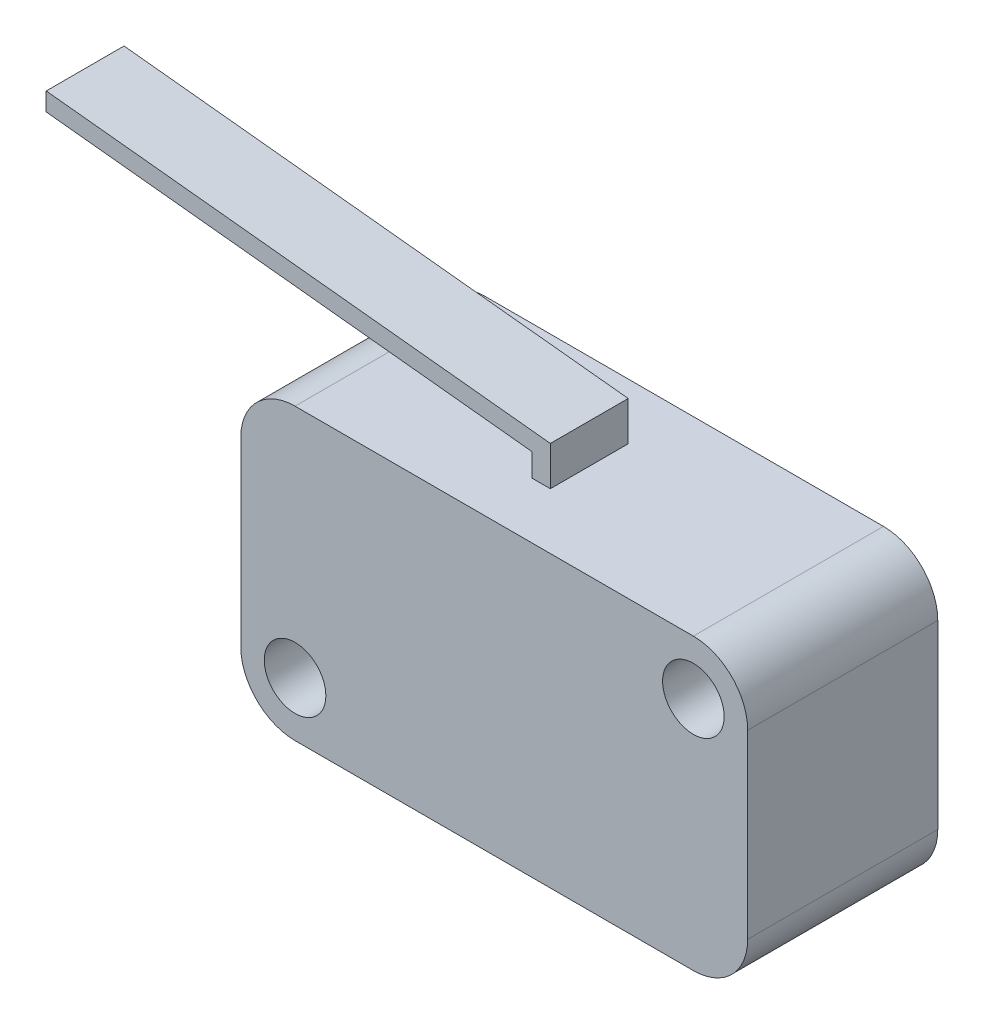
ISO-10303-21;
HEADER;
FILE_DESCRIPTION(('STEP AP214'),'2;1');
FILE_NAME('part.step','',(''),(''),'','','');
FILE_SCHEMA(('AUTOMOTIVE_DESIGN { 1 0 10303 214 1 1 1 1 }'));
ENDSEC;
DATA;
#1=APPLICATION_CONTEXT('core data for automotive mechanical design processes');
#2=APPLICATION_PROTOCOL_DEFINITION('international standard','automotive_design',2000,#1);
#3=PRODUCT_CONTEXT('',#1,'mechanical');
#4=PRODUCT('Part','Part','',(#3));
#5=PRODUCT_RELATED_PRODUCT_CATEGORY('part','',(#4));
#6=PRODUCT_DEFINITION_FORMATION('','',#4);
#7=PRODUCT_DEFINITION_CONTEXT('part definition',#1,'design');
#8=PRODUCT_DEFINITION('design','',#6,#7);
#9=PRODUCT_DEFINITION_SHAPE('','',#8);
#10=(LENGTH_UNIT() NAMED_UNIT(*) SI_UNIT(.MILLI.,.METRE.));
#11=(NAMED_UNIT(*) PLANE_ANGLE_UNIT() SI_UNIT($,.RADIAN.));
#12=(NAMED_UNIT(*) SI_UNIT($,.STERADIAN.) SOLID_ANGLE_UNIT());
#13=UNCERTAINTY_MEASURE_WITH_UNIT(LENGTH_MEASURE(1.E-05),#10,'distance_accuracy_value','');
#14=(GEOMETRIC_REPRESENTATION_CONTEXT(3) GLOBAL_UNCERTAINTY_ASSIGNED_CONTEXT((#13)) GLOBAL_UNIT_ASSIGNED_CONTEXT((#10,
#11,#12)) REPRESENTATION_CONTEXT('',''));
#15=CARTESIAN_POINT('',(0.,0.,0.));
#16=DIRECTION('',(0.,0.,1.));
#17=DIRECTION('',(1.,0.,0.));
#18=AXIS2_PLACEMENT_3D('',#15,#16,#17);
#19=CARTESIAN_POINT('',(0.,8.,38.8095787479277));
#20=DIRECTION('',(-1.,0.,0.));
#21=DIRECTION('',(0.,-1.,0.));
#22=AXIS2_PLACEMENT_3D('',#19,#20,#21);
#23=PLANE('',#22);
#24=DIRECTION('',(0.,0.,-1.));
#25=VECTOR('',#24,1.);
#26=CARTESIAN_POINT('',(0.,8.,38.8095787479277));
#27=LINE('',#26,#25);
#28=CARTESIAN_POINT('',(0.,8.,7.4));
#29=VERTEX_POINT('',#28);
#30=CARTESIAN_POINT('',(0.,8.,3.1));
#31=VERTEX_POINT('',#30);
#32=EDGE_CURVE('E153',#29,#31,#27,.T.);
#33=ORIENTED_EDGE('',*,*,#32,.T.);
#34=DIRECTION('',(0.,-1.,0.));
#35=VECTOR('',#34,1.);
#36=CARTESIAN_POINT('',(0.,8.,3.1));
#37=LINE('',#36,#35);
#38=CARTESIAN_POINT('',(0.,10.1671145368648,3.1));
#39=VERTEX_POINT('',#38);
#40=EDGE_CURVE('E136',#39,#31,#37,.T.);
#41=ORIENTED_EDGE('',*,*,#40,.F.);
#42=DIRECTION('',(0.,0.,-1.));
#43=VECTOR('',#42,1.);
#44=CARTESIAN_POINT('',(0.,10.1671145368648,38.8095787479277));
#45=LINE('',#44,#43);
#46=CARTESIAN_POINT('',(0.,10.1671145368648,7.4));
#47=VERTEX_POINT('',#46);
#48=EDGE_CURVE('E160',#47,#39,#45,.T.);
#49=ORIENTED_EDGE('',*,*,#48,.F.);
#50=DIRECTION('',(0.,1.,0.));
#51=VECTOR('',#50,1.);
#52=CARTESIAN_POINT('',(0.,13.1055525503102,7.4));
#53=LINE('',#52,#51);
#54=EDGE_CURVE('E159',#29,#47,#53,.T.);
#55=ORIENTED_EDGE('',*,*,#54,.F.);
#56=EDGE_LOOP('',(#33,#41,#49,#55));
#57=FACE_BOUND('',#56,.T.);
#58=ADVANCED_FACE('F35',(#57),#23,.F.);
#59=CARTESIAN_POINT('',(0.,10.1671145368648,38.8095787479277));
#60=DIRECTION('',(-0.104944214765905,-0.994478110260436,0.));
#61=DIRECTION('',(0.994478110260436,-0.104944214765905,0.));
#62=AXIS2_PLACEMENT_3D('',#59,#60,#61);
#63=PLANE('',#62);
#64=ORIENTED_EDGE('',*,*,#48,.T.);
#65=DIRECTION('',(-0.994478110260436,0.104944214765905,0.));
#66=VECTOR('',#65,1.);
#67=CARTESIAN_POINT('',(0.,10.1671145368648,3.1));
#68=LINE('',#67,#66);
#69=CARTESIAN_POINT('',(-27.8453870872922,13.1055525503102,3.1));
#70=VERTEX_POINT('',#69);
#71=EDGE_CURVE('E142',#39,#70,#68,.T.);
#72=ORIENTED_EDGE('',*,*,#71,.T.);
#73=DIRECTION('',(0.,0.,-1.));
#74=VECTOR('',#73,1.);
#75=CARTESIAN_POINT('',(-27.8453870872922,13.1055525503102,38.8095787479277));
#76=LINE('',#75,#74);
#77=CARTESIAN_POINT('',(-27.8453870872922,13.1055525503102,7.4));
#78=VERTEX_POINT('',#77);
#79=EDGE_CURVE('E162',#78,#70,#76,.T.);
#80=ORIENTED_EDGE('',*,*,#79,.F.);
#81=DIRECTION('',(-0.994478110260436,0.104944214765905,0.));
#82=VECTOR('',#81,1.);
#83=CARTESIAN_POINT('',(0.,10.1671145368648,7.4));
#84=LINE('',#83,#82);
#85=EDGE_CURVE('E164',#47,#78,#84,.T.);
#86=ORIENTED_EDGE('',*,*,#85,.F.);
#87=EDGE_LOOP('',(#64,#72,#80,#86));
#88=FACE_BOUND('',#87,.T.);
#89=ADVANCED_FACE('F287',(#88),#63,.F.);
#90=CARTESIAN_POINT('',(-27.8453870872922,13.1055525503102,38.8095787479277));
#91=DIRECTION('',(1.,0.,0.));
#92=DIRECTION('',(0.,1.,0.));
#93=AXIS2_PLACEMENT_3D('',#90,#91,#92);
#94=PLANE('',#93);
#95=ORIENTED_EDGE('',*,*,#79,.T.);
#96=DIRECTION('',(0.,-1.,0.));
#97=VECTOR('',#96,1.);
#98=CARTESIAN_POINT('',(-27.8453870872922,13.1055525503102,3.1));
#99=LINE('',#98,#97);
#100=CARTESIAN_POINT('',(-27.8453870872922,12.1,3.1));
#101=VERTEX_POINT('',#100);
#102=EDGE_CURVE('E460',#70,#101,#99,.T.);
#103=ORIENTED_EDGE('',*,*,#102,.T.);
#104=DIRECTION('',(0.,0.,-1.));
#105=VECTOR('',#104,1.);
#106=CARTESIAN_POINT('',(-27.8453870872922,12.1,38.8095787479277));
#107=LINE('',#106,#105);
#108=CARTESIAN_POINT('',(-27.8453870872922,12.1,7.4));
#109=VERTEX_POINT('',#108);
#110=EDGE_CURVE('E171',#109,#101,#107,.T.);
#111=ORIENTED_EDGE('',*,*,#110,.F.);
#112=DIRECTION('',(0.,-1.,0.));
#113=VECTOR('',#112,1.);
#114=CARTESIAN_POINT('',(-27.8453870872922,13.1055525503102,7.4));
#115=LINE('',#114,#113);
#116=EDGE_CURVE('E466',#78,#109,#115,.T.);
#117=ORIENTED_EDGE('',*,*,#116,.F.);
#118=EDGE_LOOP('',(#95,#103,#111,#117));
#119=FACE_BOUND('',#118,.T.);
#120=ADVANCED_FACE('F292',(#119),#94,.F.);
#121=CARTESIAN_POINT('',(-27.8453870872922,12.1,38.8095787479277));
#122=DIRECTION('',(0.104944214765905,0.994478110260436,0.));
#123=DIRECTION('',(-0.994478110260436,0.104944214765905,0.));
#124=AXIS2_PLACEMENT_3D('',#121,#122,#123);
#125=PLANE('',#124);
#126=ORIENTED_EDGE('',*,*,#110,.T.);
#127=DIRECTION('',(0.994478110260436,-0.104944214765905,0.));
#128=VECTOR('',#127,1.);
#129=CARTESIAN_POINT('',(-27.8453870872922,12.1,3.1));
#130=LINE('',#129,#128);
#131=CARTESIAN_POINT('',(-1.,9.26708890935282,3.1));
#132=VERTEX_POINT('',#131);
#133=EDGE_CURVE('E458',#101,#132,#130,.T.);
#134=ORIENTED_EDGE('',*,*,#133,.T.);
#135=DIRECTION('',(0.,0.,-1.));
#136=VECTOR('',#135,1.);
#137=CARTESIAN_POINT('',(-1.,9.26708890935282,38.8095787479277));
#138=LINE('',#137,#136);
#139=CARTESIAN_POINT('',(-1.,9.26708890935282,7.4));
#140=VERTEX_POINT('',#139);
#141=EDGE_CURVE('E174',#140,#132,#138,.T.);
#142=ORIENTED_EDGE('',*,*,#141,.F.);
#143=DIRECTION('',(0.994478110260436,-0.104944214765905,0.));
#144=VECTOR('',#143,1.);
#145=CARTESIAN_POINT('',(-27.8453870872922,12.1,7.4));
#146=LINE('',#145,#144);
#147=EDGE_CURVE('E49',#109,#140,#146,.T.);
#148=ORIENTED_EDGE('',*,*,#147,.F.);
#149=EDGE_LOOP('',(#126,#134,#142,#148));
#150=FACE_BOUND('',#149,.T.);
#151=ADVANCED_FACE('F372',(#150),#125,.F.);
#152=CARTESIAN_POINT('',(-1.,9.26708890935282,38.8095787479277));
#153=DIRECTION('',(1.,0.,0.));
#154=DIRECTION('',(0.,1.,0.));
#155=AXIS2_PLACEMENT_3D('',#152,#153,#154);
#156=PLANE('',#155);
#157=ORIENTED_EDGE('',*,*,#141,.T.);
#158=DIRECTION('',(0.,-1.,0.));
#159=VECTOR('',#158,1.);
#160=CARTESIAN_POINT('',(-1.,9.26708890935282,3.1));
#161=LINE('',#160,#159);
#162=CARTESIAN_POINT('',(-0.999999999999999,8.,3.1));
#163=VERTEX_POINT('',#162);
#164=EDGE_CURVE('E156',#132,#163,#161,.T.);
#165=ORIENTED_EDGE('',*,*,#164,.T.);
#166=DIRECTION('',(0.,0.,-1.));
#167=VECTOR('',#166,1.);
#168=CARTESIAN_POINT('',(-1.,8.,38.8095787479277));
#169=LINE('',#168,#167);
#170=CARTESIAN_POINT('',(-1.,8.,7.4));
#171=VERTEX_POINT('',#170);
#172=EDGE_CURVE('E155',#171,#163,#169,.T.);
#173=ORIENTED_EDGE('',*,*,#172,.F.);
#174=DIRECTION('',(0.,-1.,0.));
#175=VECTOR('',#174,1.);
#176=CARTESIAN_POINT('',(-1.,9.26708890935282,7.4));
#177=LINE('',#176,#175);
#178=EDGE_CURVE('E11',#140,#171,#177,.T.);
#179=ORIENTED_EDGE('',*,*,#178,.F.);
#180=EDGE_LOOP('',(#157,#165,#173,#179));
#181=FACE_BOUND('',#180,.T.);
#182=ADVANCED_FACE('F312',(#181),#156,.F.);
#183=CARTESIAN_POINT('',(14.,8.,10.5));
#184=DIRECTION('',(0.,-1.,0.));
#185=DIRECTION('',(0.,0.,-1.));
#186=AXIS2_PLACEMENT_3D('',#183,#184,#185);
#187=PLANE('',#186);
#188=DIRECTION('',(-1.,0.,0.));
#189=VECTOR('',#188,1.);
#190=CARTESIAN_POINT('',(14.,8.,0.));
#191=LINE('',#190,#189);
#192=CARTESIAN_POINT('',(11.,8.,0.));
#193=VERTEX_POINT('',#192);
#194=CARTESIAN_POINT('',(-11.,8.,0.));
#195=VERTEX_POINT('',#194);
#196=EDGE_CURVE('E194',#193,#195,#191,.T.);
#197=ORIENTED_EDGE('',*,*,#196,.T.);
#198=DIRECTION('',(0.,0.,-1.));
#199=VECTOR('',#198,1.);
#200=CARTESIAN_POINT('',(-11.,8.,10.5));
#201=LINE('',#200,#199);
#202=CARTESIAN_POINT('',(-11.,8.,10.5));
#203=VERTEX_POINT('',#202);
#204=EDGE_CURVE('E227',#195,#203,#201,.F.);
#205=ORIENTED_EDGE('',*,*,#204,.T.);
#206=DIRECTION('',(-1.,0.,0.));
#207=VECTOR('',#206,1.);
#208=CARTESIAN_POINT('',(14.,8.,10.5));
#209=LINE('',#208,#207);
#210=CARTESIAN_POINT('',(11.,8.,10.5));
#211=VERTEX_POINT('',#210);
#212=EDGE_CURVE('E199',#211,#203,#209,.T.);
#213=ORIENTED_EDGE('',*,*,#212,.F.);
#214=DIRECTION('',(0.,0.,-1.));
#215=VECTOR('',#214,1.);
#216=CARTESIAN_POINT('',(11.,8.,10.5));
#217=LINE('',#216,#215);
#218=EDGE_CURVE('E224',#211,#193,#217,.T.);
#219=ORIENTED_EDGE('',*,*,#218,.T.);
#220=EDGE_LOOP('',(#197,#205,#213,#219));
#221=FACE_BOUND('',#220,.T.);
#222=ORIENTED_EDGE('',*,*,#172,.T.);
#223=DIRECTION('',(-1.,0.,0.));
#224=VECTOR('',#223,1.);
#225=CARTESIAN_POINT('',(0.,8.,3.1));
#226=LINE('',#225,#224);
#227=EDGE_CURVE('E139',#31,#163,#226,.T.);
#228=ORIENTED_EDGE('',*,*,#227,.F.);
#229=ORIENTED_EDGE('',*,*,#32,.F.);
#230=DIRECTION('',(1.,0.,0.));
#231=VECTOR('',#230,1.);
#232=CARTESIAN_POINT('',(-27.8453870872922,8.,7.4));
#233=LINE('',#232,#231);
#234=EDGE_CURVE('E468',#171,#29,#233,.T.);
#235=ORIENTED_EDGE('',*,*,#234,.F.);
#236=EDGE_LOOP('',(#222,#228,#229,#235));
#237=FACE_BOUND('',#236,.T.);
#238=ADVANCED_FACE('F151',(#221,#237),#187,.F.);
#239=CARTESIAN_POINT('',(-14.,-8.,10.5));
#240=DIRECTION('',(1.,0.,0.));
#241=DIRECTION('',(0.,1.,0.));
#242=AXIS2_PLACEMENT_3D('',#239,#240,#241);
#243=PLANE('',#242);
#244=DIRECTION('',(0.,-1.,0.));
#245=VECTOR('',#244,1.);
#246=CARTESIAN_POINT('',(-14.,-8.,10.5));
#247=LINE('',#246,#245);
#248=CARTESIAN_POINT('',(-14.,5.,10.5));
#249=VERTEX_POINT('',#248);
#250=CARTESIAN_POINT('',(-14.,-5.,10.5));
#251=VERTEX_POINT('',#250);
#252=EDGE_CURVE('E190',#249,#251,#247,.T.);
#253=ORIENTED_EDGE('',*,*,#252,.F.);
#254=DIRECTION('',(0.,0.,-1.));
#255=VECTOR('',#254,1.);
#256=CARTESIAN_POINT('',(-14.,5.,10.5));
#257=LINE('',#256,#255);
#258=CARTESIAN_POINT('',(-14.,5.,0.));
#259=VERTEX_POINT('',#258);
#260=EDGE_CURVE('E212',#249,#259,#257,.T.);
#261=ORIENTED_EDGE('',*,*,#260,.T.);
#262=DIRECTION('',(0.,-1.,0.));
#263=VECTOR('',#262,1.);
#264=CARTESIAN_POINT('',(-14.,-8.,0.));
#265=LINE('',#264,#263);
#266=CARTESIAN_POINT('',(-14.,-5.,0.));
#267=VERTEX_POINT('',#266);
#268=EDGE_CURVE('E181',#259,#267,#265,.T.);
#269=ORIENTED_EDGE('',*,*,#268,.T.);
#270=DIRECTION('',(0.,0.,-1.));
#271=VECTOR('',#270,1.);
#272=CARTESIAN_POINT('',(-14.,-5.,10.5));
#273=LINE('',#272,#271);
#274=EDGE_CURVE('E202',#267,#251,#273,.F.);
#275=ORIENTED_EDGE('',*,*,#274,.T.);
#276=EDGE_LOOP('',(#253,#261,#269,#275));
#277=FACE_BOUND('',#276,.T.);
#278=ADVANCED_FACE('F276',(#277),#243,.F.);
#279=CARTESIAN_POINT('',(14.,-8.,10.5));
#280=DIRECTION('',(0.,1.,0.));
#281=DIRECTION('',(-1.,0.,0.));
#282=AXIS2_PLACEMENT_3D('',#279,#280,#281);
#283=PLANE('',#282);
#284=DIRECTION('',(1.,0.,0.));
#285=VECTOR('',#284,1.);
#286=CARTESIAN_POINT('',(14.,-8.,0.));
#287=LINE('',#286,#285);
#288=CARTESIAN_POINT('',(-11.,-8.,0.));
#289=VERTEX_POINT('',#288);
#290=CARTESIAN_POINT('',(11.,-8.,0.));
#291=VERTEX_POINT('',#290);
#292=EDGE_CURVE('E205',#289,#291,#287,.T.);
#293=ORIENTED_EDGE('',*,*,#292,.T.);
#294=DIRECTION('',(0.,0.,-1.));
#295=VECTOR('',#294,1.);
#296=CARTESIAN_POINT('',(11.,-8.,10.5));
#297=LINE('',#296,#295);
#298=CARTESIAN_POINT('',(11.,-8.,10.5));
#299=VERTEX_POINT('',#298);
#300=EDGE_CURVE('E43',#291,#299,#297,.F.);
#301=ORIENTED_EDGE('',*,*,#300,.T.);
#302=DIRECTION('',(1.,0.,0.));
#303=VECTOR('',#302,1.);
#304=CARTESIAN_POINT('',(14.,-8.,10.5));
#305=LINE('',#304,#303);
#306=CARTESIAN_POINT('',(-11.,-8.,10.5));
#307=VERTEX_POINT('',#306);
#308=EDGE_CURVE('E193',#307,#299,#305,.T.);
#309=ORIENTED_EDGE('',*,*,#308,.F.);
#310=DIRECTION('',(0.,0.,-1.));
#311=VECTOR('',#310,1.);
#312=CARTESIAN_POINT('',(-11.,-8.,10.5));
#313=LINE('',#312,#311);
#314=EDGE_CURVE('E241',#307,#289,#313,.T.);
#315=ORIENTED_EDGE('',*,*,#314,.T.);
#316=EDGE_LOOP('',(#293,#301,#309,#315));
#317=FACE_BOUND('',#316,.T.);
#318=ADVANCED_FACE('F246',(#317),#283,.F.);
#319=CARTESIAN_POINT('',(14.,-8.,10.5));
#320=DIRECTION('',(-1.,0.,0.));
#321=DIRECTION('',(0.,0.,1.));
#322=AXIS2_PLACEMENT_3D('',#319,#320,#321);
#323=PLANE('',#322);
#324=DIRECTION('',(0.,1.,0.));
#325=VECTOR('',#324,1.);
#326=CARTESIAN_POINT('',(14.,-8.,0.));
#327=LINE('',#326,#325);
#328=CARTESIAN_POINT('',(14.,-5.,0.));
#329=VERTEX_POINT('',#328);
#330=CARTESIAN_POINT('',(14.,5.,0.));
#331=VERTEX_POINT('',#330);
#332=EDGE_CURVE('E208',#329,#331,#327,.T.);
#333=ORIENTED_EDGE('',*,*,#332,.T.);
#334=DIRECTION('',(0.,0.,-1.));
#335=VECTOR('',#334,1.);
#336=CARTESIAN_POINT('',(14.,5.,10.5));
#337=LINE('',#336,#335);
#338=CARTESIAN_POINT('',(14.,5.,10.5));
#339=VERTEX_POINT('',#338);
#340=EDGE_CURVE('E57',#331,#339,#337,.F.);
#341=ORIENTED_EDGE('',*,*,#340,.T.);
#342=DIRECTION('',(0.,1.,0.));
#343=VECTOR('',#342,1.);
#344=CARTESIAN_POINT('',(14.,-8.,10.5));
#345=LINE('',#344,#343);
#346=CARTESIAN_POINT('',(14.,-5.,10.5));
#347=VERTEX_POINT('',#346);
#348=EDGE_CURVE('E197',#347,#339,#345,.T.);
#349=ORIENTED_EDGE('',*,*,#348,.F.);
#350=DIRECTION('',(0.,0.,-1.));
#351=VECTOR('',#350,1.);
#352=CARTESIAN_POINT('',(14.,-5.,10.5));
#353=LINE('',#352,#351);
#354=EDGE_CURVE('E237',#347,#329,#353,.T.);
#355=ORIENTED_EDGE('',*,*,#354,.T.);
#356=EDGE_LOOP('',(#333,#341,#349,#355));
#357=FACE_BOUND('',#356,.T.);
#358=ADVANCED_FACE('F258',(#357),#323,.F.);
#359=CARTESIAN_POINT('',(0.,0.,10.5));
#360=DIRECTION('',(0.,0.,1.));
#361=DIRECTION('',(1.,0.,0.));
#362=AXIS2_PLACEMENT_3D('',#359,#360,#361);
#363=PLANE('',#362);
#364=ORIENTED_EDGE('',*,*,#212,.T.);
#365=CARTESIAN_POINT('',(-11.,5.,10.5));
#366=DIRECTION('',(0.,0.,1.));
#367=DIRECTION('',(1.,0.,0.));
#368=AXIS2_PLACEMENT_3D('',#365,#366,#367);
#369=CIRCLE('',#368,3.);
#370=EDGE_CURVE('E235',#203,#249,#369,.T.);
#371=ORIENTED_EDGE('',*,*,#370,.T.);
#372=ORIENTED_EDGE('',*,*,#252,.T.);
#373=CARTESIAN_POINT('',(-11.,-5.,10.5));
#374=DIRECTION('',(0.,0.,1.));
#375=DIRECTION('',(1.,0.,0.));
#376=AXIS2_PLACEMENT_3D('',#373,#374,#375);
#377=CIRCLE('',#376,3.);
#378=EDGE_CURVE('E229',#251,#307,#377,.T.);
#379=ORIENTED_EDGE('',*,*,#378,.T.);
#380=ORIENTED_EDGE('',*,*,#308,.T.);
#381=CARTESIAN_POINT('',(11.,-5.,10.5));
#382=DIRECTION('',(0.,0.,1.));
#383=DIRECTION('',(1.,0.,0.));
#384=AXIS2_PLACEMENT_3D('',#381,#382,#383);
#385=CIRCLE('',#384,3.);
#386=EDGE_CURVE('E231',#299,#347,#385,.T.);
#387=ORIENTED_EDGE('',*,*,#386,.T.);
#388=ORIENTED_EDGE('',*,*,#348,.T.);
#389=CARTESIAN_POINT('',(11.,5.,10.5));
#390=DIRECTION('',(0.,0.,1.));
#391=DIRECTION('',(1.,0.,0.));
#392=AXIS2_PLACEMENT_3D('',#389,#390,#391);
#393=CIRCLE('',#392,3.);
#394=EDGE_CURVE('E233',#339,#211,#393,.T.);
#395=ORIENTED_EDGE('',*,*,#394,.T.);
#396=EDGE_LOOP('',(#364,#371,#372,#379,#380,#387,#388,#395));
#397=FACE_BOUND('',#396,.T.);
#398=CARTESIAN_POINT('',(-11.,-5.,10.5));
#399=DIRECTION('',(0.,0.,1.));
#400=DIRECTION('',(1.,0.,0.));
#401=AXIS2_PLACEMENT_3D('',#398,#399,#400);
#402=CIRCLE('',#401,1.7);
#403=CARTESIAN_POINT('',(-9.3,-5.,10.5));
#404=VERTEX_POINT('',#403);
#405=EDGE_CURVE('E182',#404,#404,#402,.T.);
#406=ORIENTED_EDGE('',*,*,#405,.F.);
#407=EDGE_LOOP('',(#406));
#408=FACE_BOUND('',#407,.T.);
#409=CARTESIAN_POINT('',(11.,5.,10.5));
#410=DIRECTION('',(0.,0.,1.));
#411=DIRECTION('',(1.,0.,0.));
#412=AXIS2_PLACEMENT_3D('',#409,#410,#411);
#413=CIRCLE('',#412,1.7);
#414=CARTESIAN_POINT('',(12.7,5.,10.5));
#415=VERTEX_POINT('',#414);
#416=EDGE_CURVE('E176',#415,#415,#413,.T.);
#417=ORIENTED_EDGE('',*,*,#416,.F.);
#418=EDGE_LOOP('',(#417));
#419=FACE_BOUND('',#418,.T.);
#420=ADVANCED_FACE('F252',(#397,#408,#419),#363,.T.);
#421=CARTESIAN_POINT('',(0.,0.,0.));
#422=DIRECTION('',(0.,0.,1.));
#423=DIRECTION('',(1.,0.,0.));
#424=AXIS2_PLACEMENT_3D('',#421,#422,#423);
#425=PLANE('',#424);
#426=CARTESIAN_POINT('',(-11.,-5.,0.));
#427=DIRECTION('',(0.,0.,1.));
#428=DIRECTION('',(1.,0.,0.));
#429=AXIS2_PLACEMENT_3D('',#426,#427,#428);
#430=CIRCLE('',#429,1.7);
#431=CARTESIAN_POINT('',(-9.3,-5.,0.));
#432=VERTEX_POINT('',#431);
#433=EDGE_CURVE('E178',#432,#432,#430,.T.);
#434=ORIENTED_EDGE('',*,*,#433,.T.);
#435=EDGE_LOOP('',(#434));
#436=FACE_BOUND('',#435,.T.);
#437=CARTESIAN_POINT('',(11.,5.,0.));
#438=DIRECTION('',(0.,0.,1.));
#439=DIRECTION('',(1.,0.,0.));
#440=AXIS2_PLACEMENT_3D('',#437,#438,#439);
#441=CIRCLE('',#440,1.7);
#442=CARTESIAN_POINT('',(12.7,5.,0.));
#443=VERTEX_POINT('',#442);
#444=EDGE_CURVE('E185',#443,#443,#441,.T.);
#445=ORIENTED_EDGE('',*,*,#444,.T.);
#446=EDGE_LOOP('',(#445));
#447=FACE_BOUND('',#446,.T.);
#448=CARTESIAN_POINT('',(-11.,5.,0.));
#449=DIRECTION('',(0.,0.,1.));
#450=DIRECTION('',(1.,0.,0.));
#451=AXIS2_PLACEMENT_3D('',#448,#449,#450);
#452=CIRCLE('',#451,3.);
#453=EDGE_CURVE('E221',#259,#195,#452,.F.);
#454=ORIENTED_EDGE('',*,*,#453,.T.);
#455=ORIENTED_EDGE('',*,*,#196,.F.);
#456=CARTESIAN_POINT('',(11.,5.,0.));
#457=DIRECTION('',(0.,0.,1.));
#458=DIRECTION('',(1.,0.,0.));
#459=AXIS2_PLACEMENT_3D('',#456,#457,#458);
#460=CIRCLE('',#459,3.);
#461=EDGE_CURVE('E219',#193,#331,#460,.F.);
#462=ORIENTED_EDGE('',*,*,#461,.T.);
#463=ORIENTED_EDGE('',*,*,#332,.F.);
#464=CARTESIAN_POINT('',(11.,-5.,0.));
#465=DIRECTION('',(0.,0.,1.));
#466=DIRECTION('',(1.,0.,0.));
#467=AXIS2_PLACEMENT_3D('',#464,#465,#466);
#468=CIRCLE('',#467,3.);
#469=EDGE_CURVE('E217',#329,#291,#468,.F.);
#470=ORIENTED_EDGE('',*,*,#469,.T.);
#471=ORIENTED_EDGE('',*,*,#292,.F.);
#472=CARTESIAN_POINT('',(-11.,-5.,0.));
#473=DIRECTION('',(0.,0.,1.));
#474=DIRECTION('',(1.,0.,0.));
#475=AXIS2_PLACEMENT_3D('',#472,#473,#474);
#476=CIRCLE('',#475,3.);
#477=EDGE_CURVE('E215',#289,#267,#476,.F.);
#478=ORIENTED_EDGE('',*,*,#477,.T.);
#479=ORIENTED_EDGE('',*,*,#268,.F.);
#480=EDGE_LOOP('',(#454,#455,#462,#463,#470,#471,#478,#479));
#481=FACE_BOUND('',#480,.T.);
#482=ADVANCED_FACE('F260',(#436,#447,#481),#425,.F.);
#483=CARTESIAN_POINT('',(11.,5.,0.));
#484=DIRECTION('',(0.,0.,1.));
#485=DIRECTION('',(1.,0.,0.));
#486=AXIS2_PLACEMENT_3D('',#483,#484,#485);
#487=CYLINDRICAL_SURFACE('',#486,1.7);
#488=CARTESIAN_POINT('',(12.7,5.,0.));
#489=CARTESIAN_POINT('',(12.7,5.,0.109375));
#490=CARTESIAN_POINT('',(12.7,5.,0.21875));
#491=CARTESIAN_POINT('',(12.7,5.,0.4375));
#492=CARTESIAN_POINT('',(12.7,5.,0.546875));
#493=CARTESIAN_POINT('',(12.7,5.,0.765625));
#494=CARTESIAN_POINT('',(12.7,5.,0.875));
#495=CARTESIAN_POINT('',(12.7,5.,1.09375));
#496=CARTESIAN_POINT('',(12.7,5.,1.203125));
#497=CARTESIAN_POINT('',(12.7,5.,1.421875));
#498=CARTESIAN_POINT('',(12.7,5.,1.53125));
#499=CARTESIAN_POINT('',(12.7,5.,1.75));
#500=CARTESIAN_POINT('',(12.7,5.,1.859375));
#501=CARTESIAN_POINT('',(12.7,5.,2.078125));
#502=CARTESIAN_POINT('',(12.7,5.,2.1875));
#503=CARTESIAN_POINT('',(12.7,5.,2.40625));
#504=CARTESIAN_POINT('',(12.7,5.,2.515625));
#505=CARTESIAN_POINT('',(12.7,5.,2.734375));
#506=CARTESIAN_POINT('',(12.7,5.,2.84375));
#507=CARTESIAN_POINT('',(12.7,5.,3.0625));
#508=CARTESIAN_POINT('',(12.7,5.,3.171875));
#509=CARTESIAN_POINT('',(12.7,5.,3.390625));
#510=CARTESIAN_POINT('',(12.7,5.,3.5));
#511=CARTESIAN_POINT('',(12.7,5.,3.71875));
#512=CARTESIAN_POINT('',(12.7,5.,3.828125));
#513=CARTESIAN_POINT('',(12.7,5.,4.046875));
#514=CARTESIAN_POINT('',(12.7,5.,4.15625));
#515=CARTESIAN_POINT('',(12.7,5.,4.375));
#516=CARTESIAN_POINT('',(12.7,5.,4.484375));
#517=CARTESIAN_POINT('',(12.7,5.,4.703125));
#518=CARTESIAN_POINT('',(12.7,5.,4.8125));
#519=CARTESIAN_POINT('',(12.7,5.,5.03125));
#520=CARTESIAN_POINT('',(12.7,5.,5.140625));
#521=CARTESIAN_POINT('',(12.7,5.,5.359375));
#522=CARTESIAN_POINT('',(12.7,5.,5.46875));
#523=CARTESIAN_POINT('',(12.7,5.,5.6875));
#524=CARTESIAN_POINT('',(12.7,5.,5.796875));
#525=CARTESIAN_POINT('',(12.7,5.,6.015625));
#526=CARTESIAN_POINT('',(12.7,5.,6.125));
#527=CARTESIAN_POINT('',(12.7,5.,6.34375));
#528=CARTESIAN_POINT('',(12.7,5.,6.453125));
#529=CARTESIAN_POINT('',(12.7,5.,6.671875));
#530=CARTESIAN_POINT('',(12.7,5.,6.78125));
#531=CARTESIAN_POINT('',(12.7,5.,7.));
#532=CARTESIAN_POINT('',(12.7,5.,7.109375));
#533=CARTESIAN_POINT('',(12.7,5.,7.328125));
#534=CARTESIAN_POINT('',(12.7,5.,7.4375));
#535=CARTESIAN_POINT('',(12.7,5.,7.65625));
#536=CARTESIAN_POINT('',(12.7,5.,7.765625));
#537=CARTESIAN_POINT('',(12.7,5.,7.984375));
#538=CARTESIAN_POINT('',(12.7,5.,8.09375));
#539=CARTESIAN_POINT('',(12.7,5.,8.3125));
#540=CARTESIAN_POINT('',(12.7,5.,8.421875));
#541=CARTESIAN_POINT('',(12.7,5.,8.640625));
#542=CARTESIAN_POINT('',(12.7,5.,8.75));
#543=CARTESIAN_POINT('',(12.7,5.,8.96875));
#544=CARTESIAN_POINT('',(12.7,5.,9.078125));
#545=CARTESIAN_POINT('',(12.7,5.,9.296875));
#546=CARTESIAN_POINT('',(12.7,5.,9.40625));
#547=CARTESIAN_POINT('',(12.7,5.,9.625));
#548=CARTESIAN_POINT('',(12.7,5.,9.734375));
#549=CARTESIAN_POINT('',(12.7,5.,9.953125));
#550=CARTESIAN_POINT('',(12.7,5.,10.0625));
#551=CARTESIAN_POINT('',(12.7,5.,10.28125));
#552=CARTESIAN_POINT('',(12.7,5.,10.390625));
#553=CARTESIAN_POINT('',(12.7,5.,10.5));
#554=B_SPLINE_CURVE_WITH_KNOTS('',3,(#488,#489,#490,#491,#492,#493,#494,#495,#496,#497,#498,
#499,#500,#501,#502,#503,#504,#505,#506,#507,#508,#509,#510,#511,#512,#513,#514,#515,#516,#517,
#518,#519,#520,#521,#522,#523,#524,#525,#526,#527,#528,#529,#530,#531,#532,#533,#534,#535,#536,
#537,#538,#539,#540,#541,#542,#543,#544,#545,#546,#547,#548,#549,#550,#551,#552,#553),
.UNSPECIFIED.,.F.,.F.,(4,2,2,2,2,2,2,2,2,2,2,2,2,2,2,2,2,2,2,2,2,2,2,2,2,2,2,2,2,2,2,2,4),(0.,
0.328125,0.65625,0.984375,1.3125,1.640625,1.96875,2.296875,2.625,2.953125,3.28125,3.609375,
3.9375,4.265625,4.59375,4.921875,5.25,5.578125,5.90625,6.234375,6.5625,6.890625,7.21875,
7.546875,7.875,8.203125,8.53125,8.859375,9.1875,9.515625,9.84375,10.171875,10.5),.UNSPECIFIED.);
#555=EDGE_CURVE('BSEAM300',#443,#415,#554,.T.);
#556=ORIENTED_EDGE('',*,*,#444,.F.);
#557=ORIENTED_EDGE('',*,*,#416,.T.);
#558=ORIENTED_EDGE('',*,*,#555,.T.);
#559=ORIENTED_EDGE('',*,*,#555,.F.);
#560=EDGE_LOOP('',(#556,#558,#557,#559));
#561=FACE_BOUND('',#560,.T.);
#562=ADVANCED_FACE('F300',(#561),#487,.F.);
#563=CARTESIAN_POINT('',(-11.,-5.,0.));
#564=DIRECTION('',(0.,0.,1.));
#565=DIRECTION('',(1.,0.,0.));
#566=AXIS2_PLACEMENT_3D('',#563,#564,#565);
#567=CYLINDRICAL_SURFACE('',#566,1.7);
#568=CARTESIAN_POINT('',(-9.3,-5.,0.));
#569=CARTESIAN_POINT('',(-9.3,-5.,0.109375));
#570=CARTESIAN_POINT('',(-9.3,-5.,0.21875));
#571=CARTESIAN_POINT('',(-9.3,-5.,0.4375));
#572=CARTESIAN_POINT('',(-9.3,-5.,0.546875));
#573=CARTESIAN_POINT('',(-9.3,-5.,0.765625));
#574=CARTESIAN_POINT('',(-9.3,-5.,0.875));
#575=CARTESIAN_POINT('',(-9.3,-5.,1.09375));
#576=CARTESIAN_POINT('',(-9.3,-5.,1.203125));
#577=CARTESIAN_POINT('',(-9.3,-5.,1.421875));
#578=CARTESIAN_POINT('',(-9.3,-5.,1.53125));
#579=CARTESIAN_POINT('',(-9.3,-5.,1.75));
#580=CARTESIAN_POINT('',(-9.3,-5.,1.859375));
#581=CARTESIAN_POINT('',(-9.3,-5.,2.078125));
#582=CARTESIAN_POINT('',(-9.3,-5.,2.1875));
#583=CARTESIAN_POINT('',(-9.3,-5.,2.40625));
#584=CARTESIAN_POINT('',(-9.3,-5.,2.515625));
#585=CARTESIAN_POINT('',(-9.3,-5.,2.734375));
#586=CARTESIAN_POINT('',(-9.3,-5.,2.84375));
#587=CARTESIAN_POINT('',(-9.3,-5.,3.0625));
#588=CARTESIAN_POINT('',(-9.3,-5.,3.171875));
#589=CARTESIAN_POINT('',(-9.3,-5.,3.390625));
#590=CARTESIAN_POINT('',(-9.3,-5.,3.5));
#591=CARTESIAN_POINT('',(-9.3,-5.,3.71875));
#592=CARTESIAN_POINT('',(-9.3,-5.,3.828125));
#593=CARTESIAN_POINT('',(-9.3,-5.,4.046875));
#594=CARTESIAN_POINT('',(-9.3,-5.,4.15625));
#595=CARTESIAN_POINT('',(-9.3,-5.,4.375));
#596=CARTESIAN_POINT('',(-9.3,-5.,4.484375));
#597=CARTESIAN_POINT('',(-9.3,-5.,4.703125));
#598=CARTESIAN_POINT('',(-9.3,-5.,4.8125));
#599=CARTESIAN_POINT('',(-9.3,-5.,5.03125));
#600=CARTESIAN_POINT('',(-9.3,-5.,5.140625));
#601=CARTESIAN_POINT('',(-9.3,-5.,5.359375));
#602=CARTESIAN_POINT('',(-9.3,-5.,5.46875));
#603=CARTESIAN_POINT('',(-9.3,-5.,5.6875));
#604=CARTESIAN_POINT('',(-9.3,-5.,5.796875));
#605=CARTESIAN_POINT('',(-9.3,-5.,6.015625));
#606=CARTESIAN_POINT('',(-9.3,-5.,6.125));
#607=CARTESIAN_POINT('',(-9.3,-5.,6.34375));
#608=CARTESIAN_POINT('',(-9.3,-5.,6.453125));
#609=CARTESIAN_POINT('',(-9.3,-5.,6.671875));
#610=CARTESIAN_POINT('',(-9.3,-5.,6.78125));
#611=CARTESIAN_POINT('',(-9.3,-5.,7.));
#612=CARTESIAN_POINT('',(-9.3,-5.,7.109375));
#613=CARTESIAN_POINT('',(-9.3,-5.,7.328125));
#614=CARTESIAN_POINT('',(-9.3,-5.,7.4375));
#615=CARTESIAN_POINT('',(-9.3,-5.,7.65625));
#616=CARTESIAN_POINT('',(-9.3,-5.,7.765625));
#617=CARTESIAN_POINT('',(-9.3,-5.,7.984375));
#618=CARTESIAN_POINT('',(-9.3,-5.,8.09375));
#619=CARTESIAN_POINT('',(-9.3,-5.,8.3125));
#620=CARTESIAN_POINT('',(-9.3,-5.,8.421875));
#621=CARTESIAN_POINT('',(-9.3,-5.,8.640625));
#622=CARTESIAN_POINT('',(-9.3,-5.,8.75));
#623=CARTESIAN_POINT('',(-9.3,-5.,8.96875));
#624=CARTESIAN_POINT('',(-9.3,-5.,9.078125));
#625=CARTESIAN_POINT('',(-9.3,-5.,9.296875));
#626=CARTESIAN_POINT('',(-9.3,-5.,9.40625));
#627=CARTESIAN_POINT('',(-9.3,-5.,9.625));
#628=CARTESIAN_POINT('',(-9.3,-5.,9.734375));
#629=CARTESIAN_POINT('',(-9.3,-5.,9.953125));
#630=CARTESIAN_POINT('',(-9.3,-5.,10.0625));
#631=CARTESIAN_POINT('',(-9.3,-5.,10.28125));
#632=CARTESIAN_POINT('',(-9.3,-5.,10.390625));
#633=CARTESIAN_POINT('',(-9.3,-5.,10.5));
#634=B_SPLINE_CURVE_WITH_KNOTS('',3,(#568,#569,#570,#571,#572,#573,#574,#575,#576,#577,#578,
#579,#580,#581,#582,#583,#584,#585,#586,#587,#588,#589,#590,#591,#592,#593,#594,#595,#596,#597,
#598,#599,#600,#601,#602,#603,#604,#605,#606,#607,#608,#609,#610,#611,#612,#613,#614,#615,#616,
#617,#618,#619,#620,#621,#622,#623,#624,#625,#626,#627,#628,#629,#630,#631,#632,#633),
.UNSPECIFIED.,.F.,.F.,(4,2,2,2,2,2,2,2,2,2,2,2,2,2,2,2,2,2,2,2,2,2,2,2,2,2,2,2,2,2,2,2,4),(0.,
0.328125,0.65625,0.984375,1.3125,1.640625,1.96875,2.296875,2.625,2.953125,3.28125,3.609375,
3.9375,4.265625,4.59375,4.921875,5.25,5.578125,5.90625,6.234375,6.5625,6.890625,7.21875,
7.546875,7.875,8.203125,8.53125,8.859375,9.1875,9.515625,9.84375,10.171875,10.5),.UNSPECIFIED.);
#635=EDGE_CURVE('BSEAM297',#432,#404,#634,.T.);
#636=ORIENTED_EDGE('',*,*,#433,.F.);
#637=ORIENTED_EDGE('',*,*,#405,.T.);
#638=ORIENTED_EDGE('',*,*,#635,.T.);
#639=ORIENTED_EDGE('',*,*,#635,.F.);
#640=EDGE_LOOP('',(#636,#638,#637,#639));
#641=FACE_BOUND('',#640,.T.);
#642=ADVANCED_FACE('F297',(#641),#567,.F.);
#643=CARTESIAN_POINT('',(-11.,5.,10.5));
#644=DIRECTION('',(0.,0.,-1.));
#645=DIRECTION('',(-1.,0.,0.));
#646=AXIS2_PLACEMENT_3D('',#643,#644,#645);
#647=CYLINDRICAL_SURFACE('',#646,3.);
#648=ORIENTED_EDGE('',*,*,#370,.F.);
#649=ORIENTED_EDGE('',*,*,#204,.F.);
#650=ORIENTED_EDGE('',*,*,#453,.F.);
#651=ORIENTED_EDGE('',*,*,#260,.F.);
#652=EDGE_LOOP('',(#648,#649,#650,#651));
#653=FACE_BOUND('',#652,.T.);
#654=ADVANCED_FACE('F273',(#653),#647,.T.);
#655=CARTESIAN_POINT('',(11.,5.,10.5));
#656=DIRECTION('',(0.,0.,-1.));
#657=DIRECTION('',(-1.,0.,0.));
#658=AXIS2_PLACEMENT_3D('',#655,#656,#657);
#659=CYLINDRICAL_SURFACE('',#658,3.);
#660=ORIENTED_EDGE('',*,*,#394,.F.);
#661=ORIENTED_EDGE('',*,*,#340,.F.);
#662=ORIENTED_EDGE('',*,*,#461,.F.);
#663=ORIENTED_EDGE('',*,*,#218,.F.);
#664=EDGE_LOOP('',(#660,#661,#662,#663));
#665=FACE_BOUND('',#664,.T.);
#666=ADVANCED_FACE('F265',(#665),#659,.T.);
#667=CARTESIAN_POINT('',(11.,-5.,10.5));
#668=DIRECTION('',(0.,0.,-1.));
#669=DIRECTION('',(-1.,0.,0.));
#670=AXIS2_PLACEMENT_3D('',#667,#668,#669);
#671=CYLINDRICAL_SURFACE('',#670,3.);
#672=ORIENTED_EDGE('',*,*,#386,.F.);
#673=ORIENTED_EDGE('',*,*,#300,.F.);
#674=ORIENTED_EDGE('',*,*,#469,.F.);
#675=ORIENTED_EDGE('',*,*,#354,.F.);
#676=EDGE_LOOP('',(#672,#673,#674,#675));
#677=FACE_BOUND('',#676,.T.);
#678=ADVANCED_FACE('F256',(#677),#671,.T.);
#679=CARTESIAN_POINT('',(-11.,-5.,10.5));
#680=DIRECTION('',(0.,0.,-1.));
#681=DIRECTION('',(-1.,0.,0.));
#682=AXIS2_PLACEMENT_3D('',#679,#680,#681);
#683=CYLINDRICAL_SURFACE('',#682,3.);
#684=ORIENTED_EDGE('',*,*,#378,.F.);
#685=ORIENTED_EDGE('',*,*,#274,.F.);
#686=ORIENTED_EDGE('',*,*,#477,.F.);
#687=ORIENTED_EDGE('',*,*,#314,.F.);
#688=EDGE_LOOP('',(#684,#685,#686,#687));
#689=FACE_BOUND('',#688,.T.);
#690=ADVANCED_FACE('F37',(#689),#683,.T.);
#691=CARTESIAN_POINT('',(0.,0.,7.4));
#692=DIRECTION('',(0.,0.,1.));
#693=DIRECTION('',(1.,0.,0.));
#694=AXIS2_PLACEMENT_3D('',#691,#692,#693);
#695=PLANE('',#694);
#696=ORIENTED_EDGE('',*,*,#85,.T.);
#697=ORIENTED_EDGE('',*,*,#116,.T.);
#698=ORIENTED_EDGE('',*,*,#147,.T.);
#699=ORIENTED_EDGE('',*,*,#178,.T.);
#700=ORIENTED_EDGE('',*,*,#234,.T.);
#701=ORIENTED_EDGE('',*,*,#54,.T.);
#702=EDGE_LOOP('',(#696,#697,#698,#699,#700,#701));
#703=FACE_BOUND('',#702,.T.);
#704=ADVANCED_FACE('F280',(#703),#695,.T.);
#705=CARTESIAN_POINT('',(0.,0.,3.1));
#706=DIRECTION('',(0.,0.,1.));
#707=DIRECTION('',(1.,0.,0.));
#708=AXIS2_PLACEMENT_3D('',#705,#706,#707);
#709=PLANE('',#708);
#710=ORIENTED_EDGE('',*,*,#40,.T.);
#711=ORIENTED_EDGE('',*,*,#227,.T.);
#712=ORIENTED_EDGE('',*,*,#164,.F.);
#713=ORIENTED_EDGE('',*,*,#133,.F.);
#714=ORIENTED_EDGE('',*,*,#102,.F.);
#715=ORIENTED_EDGE('',*,*,#71,.F.);
#716=EDGE_LOOP('',(#710,#711,#712,#713,#714,#715));
#717=FACE_BOUND('',#716,.T.);
#718=ADVANCED_FACE('F138',(#717),#709,.F.);
#719=CLOSED_SHELL('',(#58,#89,#120,#151,#182,#238,#278,#318,#358,#420,#482,#562,#642,#654,#666,
#678,#690,#704,#718));
#720=MANIFOLD_SOLID_BREP('B2',#719);
#721=ADVANCED_BREP_SHAPE_REPRESENTATION('',(#18,#720),#14);
#722=SHAPE_DEFINITION_REPRESENTATION(#9,#721);
ENDSEC;
END-ISO-10303-21;
